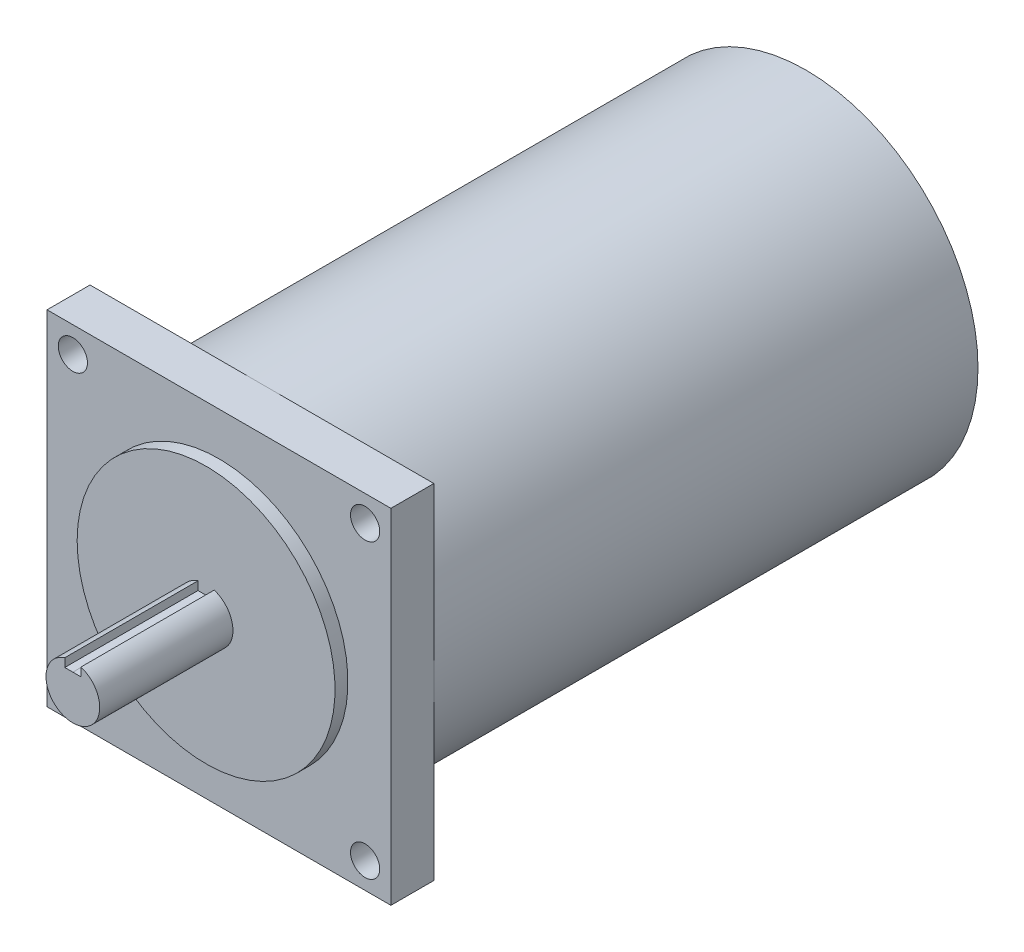
ISO-10303-21;
HEADER;
FILE_DESCRIPTION(('STEP AP214'),'2;1');
FILE_NAME('part.step','',(''),(''),'','','');
FILE_SCHEMA(('AUTOMOTIVE_DESIGN { 1 0 10303 214 1 1 1 1 }'));
ENDSEC;
DATA;
#1=APPLICATION_CONTEXT('core data for automotive mechanical design processes');
#2=APPLICATION_PROTOCOL_DEFINITION('international standard','automotive_design',2000,#1);
#3=PRODUCT_CONTEXT('',#1,'mechanical');
#4=PRODUCT('Part','Part','',(#3));
#5=PRODUCT_RELATED_PRODUCT_CATEGORY('part','',(#4));
#6=PRODUCT_DEFINITION_FORMATION('','',#4);
#7=PRODUCT_DEFINITION_CONTEXT('part definition',#1,'design');
#8=PRODUCT_DEFINITION('design','',#6,#7);
#9=PRODUCT_DEFINITION_SHAPE('','',#8);
#10=(LENGTH_UNIT() NAMED_UNIT(*) SI_UNIT(.MILLI.,.METRE.));
#11=(NAMED_UNIT(*) PLANE_ANGLE_UNIT() SI_UNIT($,.RADIAN.));
#12=(NAMED_UNIT(*) SI_UNIT($,.STERADIAN.) SOLID_ANGLE_UNIT());
#13=UNCERTAINTY_MEASURE_WITH_UNIT(LENGTH_MEASURE(1.E-05),#10,'distance_accuracy_value','');
#14=(GEOMETRIC_REPRESENTATION_CONTEXT(3) GLOBAL_UNCERTAINTY_ASSIGNED_CONTEXT((#13)) GLOBAL_UNIT_ASSIGNED_CONTEXT((#10,
#11,#12)) REPRESENTATION_CONTEXT('',''));
#15=CARTESIAN_POINT('',(0.,0.,0.));
#16=DIRECTION('',(0.,0.,1.));
#17=DIRECTION('',(1.,0.,0.));
#18=AXIS2_PLACEMENT_3D('',#15,#16,#17);
#19=CARTESIAN_POINT('',(0.,0.,0.));
#20=DIRECTION('',(0.,0.,1.));
#21=DIRECTION('',(1.,0.,0.));
#22=AXIS2_PLACEMENT_3D('',#19,#20,#21);
#23=PLANE('',#22);
#24=CARTESIAN_POINT('',(0.,0.,0.));
#25=DIRECTION('',(0.,0.,-1.));
#26=DIRECTION('',(-1.,0.,0.));
#27=AXIS2_PLACEMENT_3D('',#24,#25,#26);
#28=CIRCLE('',#27,50.8);
#29=CARTESIAN_POINT('',(-50.8,0.,0.));
#30=VERTEX_POINT('',#29);
#31=CARTESIAN_POINT('',(0.,50.8,0.));
#32=VERTEX_POINT('',#31);
#33=EDGE_CURVE('E141',#30,#32,#28,.T.);
#34=ORIENTED_EDGE('',*,*,#33,.F.);
#35=DIRECTION('',(0.,-1.,0.));
#36=VECTOR('',#35,1.);
#37=CARTESIAN_POINT('',(-50.8,50.8,0.));
#38=LINE('',#37,#36);
#39=CARTESIAN_POINT('',(-50.8,50.8,0.));
#40=VERTEX_POINT('',#39);
#41=EDGE_CURVE('E123',#40,#30,#38,.T.);
#42=ORIENTED_EDGE('',*,*,#41,.F.);
#43=DIRECTION('',(-1.,0.,0.));
#44=VECTOR('',#43,1.);
#45=CARTESIAN_POINT('',(-50.8,50.8,0.));
#46=LINE('',#45,#44);
#47=EDGE_CURVE('E143',#32,#40,#46,.T.);
#48=ORIENTED_EDGE('',*,*,#47,.F.);
#49=EDGE_LOOP('',(#34,#42,#48));
#50=FACE_BOUND('',#49,.T.);
#51=CARTESIAN_POINT('',(-43.18,43.18,0.));
#52=DIRECTION('',(0.,0.,1.));
#53=DIRECTION('',(1.,0.,0.));
#54=AXIS2_PLACEMENT_3D('',#51,#52,#53);
#55=CIRCLE('',#54,4.318);
#56=CARTESIAN_POINT('',(-38.862,43.18,0.));
#57=VERTEX_POINT('',#56);
#58=EDGE_CURVE('E196',#57,#57,#55,.T.);
#59=ORIENTED_EDGE('',*,*,#58,.T.);
#60=EDGE_LOOP('',(#59));
#61=FACE_BOUND('',#60,.T.);
#62=ADVANCED_FACE('F34',(#50,#61),#23,.F.);
#63=CARTESIAN_POINT('',(50.8,0.,0.));
#64=VERTEX_POINT('',#63);
#65=EDGE_CURVE('E51',#32,#64,#28,.T.);
#66=ORIENTED_EDGE('',*,*,#65,.F.);
#67=CARTESIAN_POINT('',(50.8,50.8,0.));
#68=VERTEX_POINT('',#67);
#69=EDGE_CURVE('E139',#68,#32,#46,.T.);
#70=ORIENTED_EDGE('',*,*,#69,.F.);
#71=DIRECTION('',(0.,1.,0.));
#72=VECTOR('',#71,1.);
#73=CARTESIAN_POINT('',(50.8,50.8,0.));
#74=LINE('',#73,#72);
#75=EDGE_CURVE('E220',#64,#68,#74,.T.);
#76=ORIENTED_EDGE('',*,*,#75,.F.);
#77=EDGE_LOOP('',(#66,#70,#76));
#78=FACE_BOUND('',#77,.T.);
#79=CARTESIAN_POINT('',(43.18,43.18,0.));
#80=DIRECTION('',(0.,0.,1.));
#81=DIRECTION('',(1.,0.,0.));
#82=AXIS2_PLACEMENT_3D('',#79,#80,#81);
#83=CIRCLE('',#82,4.318);
#84=CARTESIAN_POINT('',(47.498,43.18,0.));
#85=VERTEX_POINT('',#84);
#86=EDGE_CURVE('E202',#85,#85,#83,.T.);
#87=ORIENTED_EDGE('',*,*,#86,.T.);
#88=EDGE_LOOP('',(#87));
#89=FACE_BOUND('',#88,.T.);
#90=ADVANCED_FACE('F248',(#78,#89),#23,.F.);
#91=CARTESIAN_POINT('',(0.,-50.8,0.));
#92=VERTEX_POINT('',#91);
#93=EDGE_CURVE('E151',#64,#92,#28,.T.);
#94=ORIENTED_EDGE('',*,*,#93,.F.);
#95=CARTESIAN_POINT('',(50.8,-50.8,0.));
#96=VERTEX_POINT('',#95);
#97=EDGE_CURVE('E233',#96,#64,#74,.T.);
#98=ORIENTED_EDGE('',*,*,#97,.F.);
#99=DIRECTION('',(1.,0.,0.));
#100=VECTOR('',#99,1.);
#101=CARTESIAN_POINT('',(-50.8,-50.8,0.));
#102=LINE('',#101,#100);
#103=EDGE_CURVE('E133',#92,#96,#102,.T.);
#104=ORIENTED_EDGE('',*,*,#103,.F.);
#105=EDGE_LOOP('',(#94,#98,#104));
#106=FACE_BOUND('',#105,.T.);
#107=CARTESIAN_POINT('',(43.18,-43.18,0.));
#108=DIRECTION('',(0.,0.,1.));
#109=DIRECTION('',(1.,0.,0.));
#110=AXIS2_PLACEMENT_3D('',#107,#108,#109);
#111=CIRCLE('',#110,4.318);
#112=CARTESIAN_POINT('',(47.498,-43.18,0.));
#113=VERTEX_POINT('',#112);
#114=EDGE_CURVE('E208',#113,#113,#111,.T.);
#115=ORIENTED_EDGE('',*,*,#114,.T.);
#116=EDGE_LOOP('',(#115));
#117=FACE_BOUND('',#116,.T.);
#118=ADVANCED_FACE('F251',(#106,#117),#23,.F.);
#119=CARTESIAN_POINT('',(0.,0.,55.88));
#120=DIRECTION('',(0.,0.,-1.));
#121=DIRECTION('',(-1.,0.,0.));
#122=AXIS2_PLACEMENT_3D('',#119,#120,#121);
#123=CYLINDRICAL_SURFACE('',#122,7.9375);
#124=DIRECTION('',(0.,0.,-1.));
#125=VECTOR('',#124,1.);
#126=CARTESIAN_POINT('',(2.38760548199158,7.56989077281593,302.564684499768));
#127=LINE('',#126,#125);
#128=CARTESIAN_POINT('',(2.38760548199158,7.56989077281593,55.88));
#129=VERTEX_POINT('',#128);
#130=CARTESIAN_POINT('',(2.38760548199158,7.56989077281593,16.51));
#131=VERTEX_POINT('',#130);
#132=EDGE_CURVE('E184',#129,#131,#127,.T.);
#133=ORIENTED_EDGE('',*,*,#132,.F.);
#134=CARTESIAN_POINT('',(0.,0.,55.88));
#135=DIRECTION('',(0.,0.,1.));
#136=DIRECTION('',(1.,0.,0.));
#137=AXIS2_PLACEMENT_3D('',#134,#135,#136);
#138=CIRCLE('',#137,7.9375);
#139=CARTESIAN_POINT('',(-2.38759451800842,7.56989423093719,55.88));
#140=VERTEX_POINT('',#139);
#141=EDGE_CURVE('E166',#140,#129,#138,.T.);
#142=ORIENTED_EDGE('',*,*,#141,.F.);
#143=DIRECTION('',(0.,0.,-1.));
#144=VECTOR('',#143,1.);
#145=CARTESIAN_POINT('',(-2.38759451800842,7.56989423093719,302.564684499768));
#146=LINE('',#145,#144);
#147=CARTESIAN_POINT('',(-2.38759451800842,7.56989423093719,16.51));
#148=VERTEX_POINT('',#147);
#149=EDGE_CURVE('E175',#140,#148,#146,.T.);
#150=ORIENTED_EDGE('',*,*,#149,.T.);
#151=CARTESIAN_POINT('',(0.,0.,16.51));
#152=DIRECTION('',(0.,0.,1.));
#153=DIRECTION('',(1.,0.,0.));
#154=AXIS2_PLACEMENT_3D('',#151,#152,#153);
#155=CIRCLE('',#154,7.9375);
#156=EDGE_CURVE('E152',#148,#131,#155,.T.);
#157=ORIENTED_EDGE('',*,*,#156,.T.);
#158=EDGE_LOOP('',(#133,#142,#150,#157));
#159=FACE_BOUND('',#158,.T.);
#160=ADVANCED_FACE('F285',(#159),#123,.T.);
#161=CARTESIAN_POINT('',(0.,0.,55.88));
#162=DIRECTION('',(0.,0.,1.));
#163=DIRECTION('',(1.,0.,0.));
#164=AXIS2_PLACEMENT_3D('',#161,#162,#163);
#165=PLANE('',#164);
#166=ORIENTED_EDGE('',*,*,#141,.T.);
#167=DIRECTION('',(0.,1.,0.));
#168=VECTOR('',#167,1.);
#169=CARTESIAN_POINT('',(2.38760548199158,5.06380323093719,55.88));
#170=LINE('',#169,#168);
#171=CARTESIAN_POINT('',(2.38760548199158,5.06380323093719,55.88));
#172=VERTEX_POINT('',#171);
#173=EDGE_CURVE('E162',#172,#129,#170,.T.);
#174=ORIENTED_EDGE('',*,*,#173,.F.);
#175=DIRECTION('',(1.,0.,0.));
#176=VECTOR('',#175,1.);
#177=CARTESIAN_POINT('',(5.48199157633283E-06,5.06380323093719,55.88));
#178=LINE('',#177,#176);
#179=CARTESIAN_POINT('',(5.48199157633283E-06,5.06380323093719,55.88));
#180=VERTEX_POINT('',#179);
#181=EDGE_CURVE('E159',#180,#172,#178,.T.);
#182=ORIENTED_EDGE('',*,*,#181,.F.);
#183=DIRECTION('',(1.,0.,0.));
#184=VECTOR('',#183,1.);
#185=CARTESIAN_POINT('',(5.48199157633283E-06,5.06380323093719,55.88));
#186=LINE('',#185,#184);
#187=CARTESIAN_POINT('',(-2.38759451800842,5.06380323093719,55.88));
#188=VERTEX_POINT('',#187);
#189=EDGE_CURVE('E161',#188,#180,#186,.T.);
#190=ORIENTED_EDGE('',*,*,#189,.F.);
#191=DIRECTION('',(0.,-1.,0.));
#192=VECTOR('',#191,1.);
#193=CARTESIAN_POINT('',(-2.38759451800842,5.06380323093719,55.88));
#194=LINE('',#193,#192);
#195=EDGE_CURVE('E164',#140,#188,#194,.T.);
#196=ORIENTED_EDGE('',*,*,#195,.F.);
#197=EDGE_LOOP('',(#166,#174,#182,#190,#196));
#198=FACE_BOUND('',#197,.T.);
#199=ADVANCED_FACE('F282',(#198),#165,.T.);
#200=CARTESIAN_POINT('',(0.,0.,12.7));
#201=DIRECTION('',(0.,0.,1.));
#202=DIRECTION('',(1.,0.,0.));
#203=AXIS2_PLACEMENT_3D('',#200,#201,#202);
#204=PLANE('',#203);
#205=CARTESIAN_POINT('',(0.,0.,12.7));
#206=DIRECTION('',(0.,0.,1.));
#207=DIRECTION('',(1.,0.,0.));
#208=AXIS2_PLACEMENT_3D('',#205,#206,#207);
#209=CIRCLE('',#208,38.1);
#210=CARTESIAN_POINT('',(-38.1,0.,12.7));
#211=VERTEX_POINT('',#210);
#212=EDGE_CURVE('E154',#211,#211,#209,.T.);
#213=ORIENTED_EDGE('',*,*,#212,.F.);
#214=EDGE_LOOP('',(#213));
#215=FACE_BOUND('',#214,.T.);
#216=CARTESIAN_POINT('',(43.18,43.18,12.7));
#217=DIRECTION('',(0.,0.,1.));
#218=DIRECTION('',(1.,0.,0.));
#219=AXIS2_PLACEMENT_3D('',#216,#217,#218);
#220=CIRCLE('',#219,4.318);
#221=CARTESIAN_POINT('',(47.498,43.18,12.7));
#222=VERTEX_POINT('',#221);
#223=EDGE_CURVE('E205',#222,#222,#220,.T.);
#224=ORIENTED_EDGE('',*,*,#223,.F.);
#225=EDGE_LOOP('',(#224));
#226=FACE_BOUND('',#225,.T.);
#227=CARTESIAN_POINT('',(-43.18,-43.18,12.7));
#228=DIRECTION('',(0.,0.,1.));
#229=DIRECTION('',(1.,0.,0.));
#230=AXIS2_PLACEMENT_3D('',#227,#228,#229);
#231=CIRCLE('',#230,4.318);
#232=CARTESIAN_POINT('',(-38.862,-43.18,12.7));
#233=VERTEX_POINT('',#232);
#234=EDGE_CURVE('E217',#233,#233,#231,.T.);
#235=ORIENTED_EDGE('',*,*,#234,.F.);
#236=EDGE_LOOP('',(#235));
#237=FACE_BOUND('',#236,.T.);
#238=DIRECTION('',(0.,1.,0.));
#239=VECTOR('',#238,1.);
#240=CARTESIAN_POINT('',(50.8,50.8,12.7));
#241=LINE('',#240,#239);
#242=CARTESIAN_POINT('',(50.8,-50.8,12.7));
#243=VERTEX_POINT('',#242);
#244=CARTESIAN_POINT('',(50.8,50.8,12.7));
#245=VERTEX_POINT('',#244);
#246=EDGE_CURVE('E223',#243,#245,#241,.T.);
#247=ORIENTED_EDGE('',*,*,#246,.T.);
#248=DIRECTION('',(-1.,0.,0.));
#249=VECTOR('',#248,1.);
#250=CARTESIAN_POINT('',(-50.8,50.8,12.7));
#251=LINE('',#250,#249);
#252=CARTESIAN_POINT('',(-50.8,50.8,12.7));
#253=VERTEX_POINT('',#252);
#254=EDGE_CURVE('E226',#245,#253,#251,.T.);
#255=ORIENTED_EDGE('',*,*,#254,.T.);
#256=DIRECTION('',(0.,-1.,0.));
#257=VECTOR('',#256,1.);
#258=CARTESIAN_POINT('',(-50.8,50.8,12.7));
#259=LINE('',#258,#257);
#260=CARTESIAN_POINT('',(-50.8,-50.8,12.7));
#261=VERTEX_POINT('',#260);
#262=EDGE_CURVE('E228',#253,#261,#259,.T.);
#263=ORIENTED_EDGE('',*,*,#262,.T.);
#264=DIRECTION('',(1.,0.,0.));
#265=VECTOR('',#264,1.);
#266=CARTESIAN_POINT('',(-50.8,-50.8,12.7));
#267=LINE('',#266,#265);
#268=EDGE_CURVE('E230',#261,#243,#267,.T.);
#269=ORIENTED_EDGE('',*,*,#268,.T.);
#270=EDGE_LOOP('',(#247,#255,#263,#269));
#271=FACE_BOUND('',#270,.T.);
#272=CARTESIAN_POINT('',(43.18,-43.18,12.7));
#273=DIRECTION('',(0.,0.,1.));
#274=DIRECTION('',(1.,0.,0.));
#275=AXIS2_PLACEMENT_3D('',#272,#273,#274);
#276=CIRCLE('',#275,4.318);
#277=CARTESIAN_POINT('',(47.498,-43.18,12.7));
#278=VERTEX_POINT('',#277);
#279=EDGE_CURVE('E211',#278,#278,#276,.T.);
#280=ORIENTED_EDGE('',*,*,#279,.F.);
#281=EDGE_LOOP('',(#280));
#282=FACE_BOUND('',#281,.T.);
#283=CARTESIAN_POINT('',(-43.18,43.18,12.7));
#284=DIRECTION('',(0.,0.,1.));
#285=DIRECTION('',(1.,0.,0.));
#286=AXIS2_PLACEMENT_3D('',#283,#284,#285);
#287=CIRCLE('',#286,4.318);
#288=CARTESIAN_POINT('',(-38.862,43.18,12.7));
#289=VERTEX_POINT('',#288);
#290=EDGE_CURVE('E199',#289,#289,#287,.T.);
#291=ORIENTED_EDGE('',*,*,#290,.F.);
#292=EDGE_LOOP('',(#291));
#293=FACE_BOUND('',#292,.T.);
#294=ADVANCED_FACE('F277',(#215,#226,#237,#271,#282,#293),#204,.T.);
#295=EDGE_CURVE('E59',#92,#30,#28,.T.);
#296=ORIENTED_EDGE('',*,*,#295,.F.);
#297=CARTESIAN_POINT('',(-50.8,-50.8,0.));
#298=VERTEX_POINT('',#297);
#299=EDGE_CURVE('E138',#298,#92,#102,.T.);
#300=ORIENTED_EDGE('',*,*,#299,.F.);
#301=EDGE_CURVE('E126',#30,#298,#38,.T.);
#302=ORIENTED_EDGE('',*,*,#301,.F.);
#303=EDGE_LOOP('',(#296,#300,#302));
#304=FACE_BOUND('',#303,.T.);
#305=CARTESIAN_POINT('',(-43.18,-43.18,0.));
#306=DIRECTION('',(0.,0.,1.));
#307=DIRECTION('',(1.,0.,0.));
#308=AXIS2_PLACEMENT_3D('',#305,#306,#307);
#309=CIRCLE('',#308,4.318);
#310=CARTESIAN_POINT('',(-38.862,-43.18,0.));
#311=VERTEX_POINT('',#310);
#312=EDGE_CURVE('E214',#311,#311,#309,.T.);
#313=ORIENTED_EDGE('',*,*,#312,.T.);
#314=EDGE_LOOP('',(#313));
#315=FACE_BOUND('',#314,.T.);
#316=ADVANCED_FACE('F135',(#304,#315),#23,.F.);
#317=CARTESIAN_POINT('',(50.8,50.8,12.7));
#318=DIRECTION('',(-1.,0.,0.));
#319=DIRECTION('',(0.,-1.,0.));
#320=AXIS2_PLACEMENT_3D('',#317,#318,#319);
#321=PLANE('',#320);
#322=ORIENTED_EDGE('',*,*,#97,.T.);
#323=ORIENTED_EDGE('',*,*,#75,.T.);
#324=DIRECTION('',(0.,0.,-1.));
#325=VECTOR('',#324,1.);
#326=CARTESIAN_POINT('',(50.8,50.8,12.7));
#327=LINE('',#326,#325);
#328=EDGE_CURVE('E38',#245,#68,#327,.T.);
#329=ORIENTED_EDGE('',*,*,#328,.F.);
#330=ORIENTED_EDGE('',*,*,#246,.F.);
#331=DIRECTION('',(0.,0.,-1.));
#332=VECTOR('',#331,1.);
#333=CARTESIAN_POINT('',(50.8,-50.8,12.7));
#334=LINE('',#333,#332);
#335=EDGE_CURVE('E232',#243,#96,#334,.T.);
#336=ORIENTED_EDGE('',*,*,#335,.T.);
#337=EDGE_LOOP('',(#322,#323,#329,#330,#336));
#338=FACE_BOUND('',#337,.T.);
#339=ADVANCED_FACE('F36',(#338),#321,.F.);
#340=CARTESIAN_POINT('',(-50.8,50.8,12.7));
#341=DIRECTION('',(0.,-1.,0.));
#342=DIRECTION('',(0.,0.,-1.));
#343=AXIS2_PLACEMENT_3D('',#340,#341,#342);
#344=PLANE('',#343);
#345=ORIENTED_EDGE('',*,*,#69,.T.);
#346=ORIENTED_EDGE('',*,*,#47,.T.);
#347=DIRECTION('',(0.,0.,-1.));
#348=VECTOR('',#347,1.);
#349=CARTESIAN_POINT('',(-50.8,50.8,12.7));
#350=LINE('',#349,#348);
#351=EDGE_CURVE('E130',#253,#40,#350,.T.);
#352=ORIENTED_EDGE('',*,*,#351,.F.);
#353=ORIENTED_EDGE('',*,*,#254,.F.);
#354=ORIENTED_EDGE('',*,*,#328,.T.);
#355=EDGE_LOOP('',(#345,#346,#352,#353,#354));
#356=FACE_BOUND('',#355,.T.);
#357=ADVANCED_FACE('F244',(#356),#344,.F.);
#358=CARTESIAN_POINT('',(-50.8,50.8,12.7));
#359=DIRECTION('',(1.,0.,0.));
#360=DIRECTION('',(0.,1.,0.));
#361=AXIS2_PLACEMENT_3D('',#358,#359,#360);
#362=PLANE('',#361);
#363=ORIENTED_EDGE('',*,*,#41,.T.);
#364=ORIENTED_EDGE('',*,*,#301,.T.);
#365=DIRECTION('',(0.,0.,-1.));
#366=VECTOR('',#365,1.);
#367=CARTESIAN_POINT('',(-50.8,-50.8,12.7));
#368=LINE('',#367,#366);
#369=EDGE_CURVE('E240',#261,#298,#368,.T.);
#370=ORIENTED_EDGE('',*,*,#369,.F.);
#371=ORIENTED_EDGE('',*,*,#262,.F.);
#372=ORIENTED_EDGE('',*,*,#351,.T.);
#373=EDGE_LOOP('',(#363,#364,#370,#371,#372));
#374=FACE_BOUND('',#373,.T.);
#375=ADVANCED_FACE('F124',(#374),#362,.F.);
#376=CARTESIAN_POINT('',(-50.8,-50.8,12.7));
#377=DIRECTION('',(0.,1.,0.));
#378=DIRECTION('',(0.,0.,1.));
#379=AXIS2_PLACEMENT_3D('',#376,#377,#378);
#380=PLANE('',#379);
#381=ORIENTED_EDGE('',*,*,#299,.T.);
#382=ORIENTED_EDGE('',*,*,#103,.T.);
#383=ORIENTED_EDGE('',*,*,#335,.F.);
#384=ORIENTED_EDGE('',*,*,#268,.F.);
#385=ORIENTED_EDGE('',*,*,#369,.T.);
#386=EDGE_LOOP('',(#381,#382,#383,#384,#385));
#387=FACE_BOUND('',#386,.T.);
#388=ADVANCED_FACE('F297',(#387),#380,.F.);
#389=CARTESIAN_POINT('',(-43.18,-43.18,12.7));
#390=DIRECTION('',(0.,0.,-1.));
#391=DIRECTION('',(-1.,0.,0.));
#392=AXIS2_PLACEMENT_3D('',#389,#390,#391);
#393=CYLINDRICAL_SURFACE('',#392,4.318);
#394=ORIENTED_EDGE('',*,*,#234,.T.);
#395=EDGE_LOOP('',(#394));
#396=FACE_BOUND('',#395,.T.);
#397=ORIENTED_EDGE('',*,*,#312,.F.);
#398=EDGE_LOOP('',(#397));
#399=FACE_BOUND('',#398,.T.);
#400=ADVANCED_FACE('F268',(#396,#399),#393,.F.);
#401=CARTESIAN_POINT('',(43.18,-43.18,12.7));
#402=DIRECTION('',(0.,0.,-1.));
#403=DIRECTION('',(-1.,0.,0.));
#404=AXIS2_PLACEMENT_3D('',#401,#402,#403);
#405=CYLINDRICAL_SURFACE('',#404,4.318);
#406=ORIENTED_EDGE('',*,*,#279,.T.);
#407=EDGE_LOOP('',(#406));
#408=FACE_BOUND('',#407,.T.);
#409=ORIENTED_EDGE('',*,*,#114,.F.);
#410=EDGE_LOOP('',(#409));
#411=FACE_BOUND('',#410,.T.);
#412=ADVANCED_FACE('F258',(#408,#411),#405,.F.);
#413=CARTESIAN_POINT('',(43.18,43.18,12.7));
#414=DIRECTION('',(0.,0.,-1.));
#415=DIRECTION('',(-1.,0.,0.));
#416=AXIS2_PLACEMENT_3D('',#413,#414,#415);
#417=CYLINDRICAL_SURFACE('',#416,4.318);
#418=ORIENTED_EDGE('',*,*,#223,.T.);
#419=EDGE_LOOP('',(#418));
#420=FACE_BOUND('',#419,.T.);
#421=ORIENTED_EDGE('',*,*,#86,.F.);
#422=EDGE_LOOP('',(#421));
#423=FACE_BOUND('',#422,.T.);
#424=ADVANCED_FACE('F255',(#420,#423),#417,.F.);
#425=CARTESIAN_POINT('',(-43.18,43.18,12.7));
#426=DIRECTION('',(0.,0.,-1.));
#427=DIRECTION('',(-1.,0.,0.));
#428=AXIS2_PLACEMENT_3D('',#425,#426,#427);
#429=CYLINDRICAL_SURFACE('',#428,4.318);
#430=ORIENTED_EDGE('',*,*,#290,.T.);
#431=EDGE_LOOP('',(#430));
#432=FACE_BOUND('',#431,.T.);
#433=ORIENTED_EDGE('',*,*,#58,.F.);
#434=EDGE_LOOP('',(#433));
#435=FACE_BOUND('',#434,.T.);
#436=ADVANCED_FACE('F257',(#432,#435),#429,.F.);
#437=CARTESIAN_POINT('',(0.,0.,16.51));
#438=DIRECTION('',(0.,0.,-1.));
#439=DIRECTION('',(-1.,0.,0.));
#440=AXIS2_PLACEMENT_3D('',#437,#438,#439);
#441=CYLINDRICAL_SURFACE('',#440,38.1);
#442=CARTESIAN_POINT('',(0.,0.,16.51));
#443=DIRECTION('',(0.,0.,1.));
#444=DIRECTION('',(1.,0.,0.));
#445=AXIS2_PLACEMENT_3D('',#442,#443,#444);
#446=CIRCLE('',#445,38.1);
#447=CARTESIAN_POINT('',(-38.1,0.,16.51));
#448=VERTEX_POINT('',#447);
#449=EDGE_CURVE('E192',#448,#448,#446,.T.);
#450=CARTESIAN_POINT('',(-38.1,0.,16.51));
#451=CARTESIAN_POINT('',(-38.1,0.,16.4703125));
#452=CARTESIAN_POINT('',(-38.1,0.,16.430625));
#453=CARTESIAN_POINT('',(-38.1,0.,16.35125));
#454=CARTESIAN_POINT('',(-38.1,0.,16.3115625));
#455=CARTESIAN_POINT('',(-38.1,0.,16.2321875));
#456=CARTESIAN_POINT('',(-38.1,0.,16.1925));
#457=CARTESIAN_POINT('',(-38.1,0.,16.113125));
#458=CARTESIAN_POINT('',(-38.1,0.,16.0734375));
#459=CARTESIAN_POINT('',(-38.1,0.,15.9940625));
#460=CARTESIAN_POINT('',(-38.1,0.,15.954375));
#461=CARTESIAN_POINT('',(-38.1,0.,15.875));
#462=CARTESIAN_POINT('',(-38.1,0.,15.8353125));
#463=CARTESIAN_POINT('',(-38.1,0.,15.7559375));
#464=CARTESIAN_POINT('',(-38.1,0.,15.71625));
#465=CARTESIAN_POINT('',(-38.1,0.,15.636875));
#466=CARTESIAN_POINT('',(-38.1,0.,15.5971875));
#467=CARTESIAN_POINT('',(-38.1,0.,15.5178125));
#468=CARTESIAN_POINT('',(-38.1,0.,15.478125));
#469=CARTESIAN_POINT('',(-38.1,0.,15.39875));
#470=CARTESIAN_POINT('',(-38.1,0.,15.3590625));
#471=CARTESIAN_POINT('',(-38.1,0.,15.2796875));
#472=CARTESIAN_POINT('',(-38.1,0.,15.24));
#473=CARTESIAN_POINT('',(-38.1,0.,15.160625));
#474=CARTESIAN_POINT('',(-38.1,0.,15.1209375));
#475=CARTESIAN_POINT('',(-38.1,0.,15.0415625));
#476=CARTESIAN_POINT('',(-38.1,0.,15.001875));
#477=CARTESIAN_POINT('',(-38.1,0.,14.9225));
#478=CARTESIAN_POINT('',(-38.1,0.,14.8828125));
#479=CARTESIAN_POINT('',(-38.1,0.,14.8034375));
#480=CARTESIAN_POINT('',(-38.1,0.,14.76375));
#481=CARTESIAN_POINT('',(-38.1,0.,14.684375));
#482=CARTESIAN_POINT('',(-38.1,0.,14.6446875));
#483=CARTESIAN_POINT('',(-38.1,0.,14.5653125));
#484=CARTESIAN_POINT('',(-38.1,0.,14.525625));
#485=CARTESIAN_POINT('',(-38.1,0.,14.44625));
#486=CARTESIAN_POINT('',(-38.1,0.,14.4065625));
#487=CARTESIAN_POINT('',(-38.1,0.,14.3271875));
#488=CARTESIAN_POINT('',(-38.1,0.,14.2875));
#489=CARTESIAN_POINT('',(-38.1,0.,14.208125));
#490=CARTESIAN_POINT('',(-38.1,0.,14.1684375));
#491=CARTESIAN_POINT('',(-38.1,0.,14.0890625));
#492=CARTESIAN_POINT('',(-38.1,0.,14.049375));
#493=CARTESIAN_POINT('',(-38.1,0.,13.97));
#494=CARTESIAN_POINT('',(-38.1,0.,13.9303125));
#495=CARTESIAN_POINT('',(-38.1,0.,13.8509375));
#496=CARTESIAN_POINT('',(-38.1,0.,13.81125));
#497=CARTESIAN_POINT('',(-38.1,0.,13.731875));
#498=CARTESIAN_POINT('',(-38.1,0.,13.6921875));
#499=CARTESIAN_POINT('',(-38.1,0.,13.6128125));
#500=CARTESIAN_POINT('',(-38.1,0.,13.573125));
#501=CARTESIAN_POINT('',(-38.1,0.,13.49375));
#502=CARTESIAN_POINT('',(-38.1,0.,13.4540625));
#503=CARTESIAN_POINT('',(-38.1,0.,13.3746875));
#504=CARTESIAN_POINT('',(-38.1,0.,13.335));
#505=CARTESIAN_POINT('',(-38.1,0.,13.255625));
#506=CARTESIAN_POINT('',(-38.1,0.,13.2159375));
#507=CARTESIAN_POINT('',(-38.1,0.,13.1365625));
#508=CARTESIAN_POINT('',(-38.1,0.,13.096875));
#509=CARTESIAN_POINT('',(-38.1,0.,13.0175));
#510=CARTESIAN_POINT('',(-38.1,0.,12.9778125));
#511=CARTESIAN_POINT('',(-38.1,0.,12.8984375));
#512=CARTESIAN_POINT('',(-38.1,0.,12.85875));
#513=CARTESIAN_POINT('',(-38.1,0.,12.779375));
#514=CARTESIAN_POINT('',(-38.1,0.,12.7396875));
#515=CARTESIAN_POINT('',(-38.1,0.,12.7));
#516=B_SPLINE_CURVE_WITH_KNOTS('',3,(#450,#451,#452,#453,#454,#455,#456,#457,#458,#459,#460,
#461,#462,#463,#464,#465,#466,#467,#468,#469,#470,#471,#472,#473,#474,#475,#476,#477,#478,#479,
#480,#481,#482,#483,#484,#485,#486,#487,#488,#489,#490,#491,#492,#493,#494,#495,#496,#497,#498,
#499,#500,#501,#502,#503,#504,#505,#506,#507,#508,#509,#510,#511,#512,#513,#514,#515),
.UNSPECIFIED.,.F.,.F.,(4,2,2,2,2,2,2,2,2,2,2,2,2,2,2,2,2,2,2,2,2,2,2,2,2,2,2,2,2,2,2,2,4),(0.,
0.119062499999999,0.238124999999999,0.357187499999998,0.476249999999998,0.595312499999997,
0.714375,0.833437499999999,0.952499999999998,1.0715625,1.190625,1.3096875,1.42875,1.5478125,
1.666875,1.7859375,1.905,2.0240625,2.143125,2.2621875,2.38125,2.5003125,2.619375,2.7384375,
2.8575,2.9765625,3.095625,3.2146875,3.33375,3.4528125,3.571875,3.6909375,3.81),.UNSPECIFIED.);
#517=EDGE_CURVE('BSEAM265',#448,#211,#516,.T.);
#518=ORIENTED_EDGE('',*,*,#449,.F.);
#519=ORIENTED_EDGE('',*,*,#212,.T.);
#520=ORIENTED_EDGE('',*,*,#517,.T.);
#521=ORIENTED_EDGE('',*,*,#517,.F.);
#522=EDGE_LOOP('',(#518,#520,#519,#521));
#523=FACE_BOUND('',#522,.T.);
#524=ADVANCED_FACE('F265',(#523),#441,.T.);
#525=CARTESIAN_POINT('',(0.,0.,16.51));
#526=DIRECTION('',(0.,0.,1.));
#527=DIRECTION('',(1.,0.,0.));
#528=AXIS2_PLACEMENT_3D('',#525,#526,#527);
#529=PLANE('',#528);
#530=ORIENTED_EDGE('',*,*,#156,.F.);
#531=DIRECTION('',(0.,-1.,0.));
#532=VECTOR('',#531,1.);
#533=CARTESIAN_POINT('',(-2.38759451800842,5.06380323093719,16.51));
#534=LINE('',#533,#532);
#535=CARTESIAN_POINT('',(-2.38759451800842,5.06380323093719,16.51));
#536=VERTEX_POINT('',#535);
#537=EDGE_CURVE('E167',#148,#536,#534,.T.);
#538=ORIENTED_EDGE('',*,*,#537,.T.);
#539=DIRECTION('',(1.,0.,0.));
#540=VECTOR('',#539,1.);
#541=CARTESIAN_POINT('',(5.48199157633283E-06,5.06380323093719,16.51));
#542=LINE('',#541,#540);
#543=CARTESIAN_POINT('',(5.48199157633283E-06,5.06380323093719,16.51));
#544=VERTEX_POINT('',#543);
#545=EDGE_CURVE('E169',#536,#544,#542,.T.);
#546=ORIENTED_EDGE('',*,*,#545,.T.);
#547=DIRECTION('',(1.,0.,0.));
#548=VECTOR('',#547,1.);
#549=CARTESIAN_POINT('',(5.48199157633283E-06,5.06380323093719,16.51));
#550=LINE('',#549,#548);
#551=CARTESIAN_POINT('',(2.38760548199158,5.06380323093719,16.51));
#552=VERTEX_POINT('',#551);
#553=EDGE_CURVE('E171',#544,#552,#550,.T.);
#554=ORIENTED_EDGE('',*,*,#553,.T.);
#555=DIRECTION('',(0.,1.,0.));
#556=VECTOR('',#555,1.);
#557=CARTESIAN_POINT('',(2.38760548199158,5.06380323093719,16.51));
#558=LINE('',#557,#556);
#559=EDGE_CURVE('E173',#552,#131,#558,.T.);
#560=ORIENTED_EDGE('',*,*,#559,.T.);
#561=EDGE_LOOP('',(#530,#538,#546,#554,#560));
#562=FACE_BOUND('',#561,.T.);
#563=ORIENTED_EDGE('',*,*,#449,.T.);
#564=EDGE_LOOP('',(#563));
#565=FACE_BOUND('',#564,.T.);
#566=ADVANCED_FACE('F400',(#562,#565),#529,.T.);
#567=CARTESIAN_POINT('',(2.38760548199158,5.06380323093719,302.564684499768));
#568=DIRECTION('',(-1.,0.,0.));
#569=DIRECTION('',(0.,0.,1.));
#570=AXIS2_PLACEMENT_3D('',#567,#568,#569);
#571=PLANE('',#570);
#572=DIRECTION('',(0.,0.,-1.));
#573=VECTOR('',#572,1.);
#574=CARTESIAN_POINT('',(2.38760548199158,5.06380323093719,302.564684499768));
#575=LINE('',#574,#573);
#576=EDGE_CURVE('E187',#172,#552,#575,.T.);
#577=ORIENTED_EDGE('',*,*,#576,.F.);
#578=ORIENTED_EDGE('',*,*,#173,.T.);
#579=ORIENTED_EDGE('',*,*,#132,.T.);
#580=ORIENTED_EDGE('',*,*,#559,.F.);
#581=EDGE_LOOP('',(#577,#578,#579,#580));
#582=FACE_BOUND('',#581,.T.);
#583=ADVANCED_FACE('F396',(#582),#571,.T.);
#584=CARTESIAN_POINT('',(5.48199157633283E-06,5.06380323093719,302.564684499768));
#585=DIRECTION('',(0.,1.,0.));
#586=DIRECTION('',(0.,0.,1.));
#587=AXIS2_PLACEMENT_3D('',#584,#585,#586);
#588=PLANE('',#587);
#589=DIRECTION('',(0.,0.,-1.));
#590=VECTOR('',#589,1.);
#591=CARTESIAN_POINT('',(5.48199157633283E-06,5.06380323093719,302.564684499768));
#592=LINE('',#591,#590);
#593=EDGE_CURVE('E181',#180,#544,#592,.T.);
#594=ORIENTED_EDGE('',*,*,#593,.F.);
#595=ORIENTED_EDGE('',*,*,#181,.T.);
#596=ORIENTED_EDGE('',*,*,#576,.T.);
#597=ORIENTED_EDGE('',*,*,#553,.F.);
#598=EDGE_LOOP('',(#594,#595,#596,#597));
#599=FACE_BOUND('',#598,.T.);
#600=ADVANCED_FACE('F399',(#599),#588,.T.);
#601=CARTESIAN_POINT('',(5.48199157633283E-06,5.06380323093719,302.564684499768));
#602=DIRECTION('',(0.,1.,0.));
#603=DIRECTION('',(0.,0.,1.));
#604=AXIS2_PLACEMENT_3D('',#601,#602,#603);
#605=PLANE('',#604);
#606=DIRECTION('',(0.,0.,-1.));
#607=VECTOR('',#606,1.);
#608=CARTESIAN_POINT('',(-2.38759451800842,5.06380323093719,302.564684499768));
#609=LINE('',#608,#607);
#610=EDGE_CURVE('E178',#188,#536,#609,.T.);
#611=ORIENTED_EDGE('',*,*,#610,.F.);
#612=ORIENTED_EDGE('',*,*,#189,.T.);
#613=ORIENTED_EDGE('',*,*,#593,.T.);
#614=ORIENTED_EDGE('',*,*,#545,.F.);
#615=EDGE_LOOP('',(#611,#612,#613,#614));
#616=FACE_BOUND('',#615,.T.);
#617=ADVANCED_FACE('F404',(#616),#605,.T.);
#618=CARTESIAN_POINT('',(-2.38759451800842,5.06380323093719,302.564684499768));
#619=DIRECTION('',(1.,0.,0.));
#620=DIRECTION('',(0.,0.,-1.));
#621=AXIS2_PLACEMENT_3D('',#618,#619,#620);
#622=PLANE('',#621);
#623=ORIENTED_EDGE('',*,*,#149,.F.);
#624=ORIENTED_EDGE('',*,*,#195,.T.);
#625=ORIENTED_EDGE('',*,*,#610,.T.);
#626=ORIENTED_EDGE('',*,*,#537,.F.);
#627=EDGE_LOOP('',(#623,#624,#625,#626));
#628=FACE_BOUND('',#627,.T.);
#629=ADVANCED_FACE('F338',(#628),#622,.T.);
#630=CARTESIAN_POINT('',(0.,0.,-160.782));
#631=DIRECTION('',(0.,0.,1.));
#632=DIRECTION('',(1.,0.,0.));
#633=AXIS2_PLACEMENT_3D('',#630,#631,#632);
#634=CYLINDRICAL_SURFACE('',#633,50.8);
#635=CARTESIAN_POINT('',(0.,0.,-160.782));
#636=DIRECTION('',(0.,0.,-1.));
#637=DIRECTION('',(-1.,0.,0.));
#638=AXIS2_PLACEMENT_3D('',#635,#636,#637);
#639=CIRCLE('',#638,50.8);
#640=CARTESIAN_POINT('',(-50.8,0.,-160.782));
#641=VERTEX_POINT('',#640);
#642=EDGE_CURVE('E146',#641,#641,#639,.T.);
#643=ORIENTED_EDGE('',*,*,#642,.F.);
#644=EDGE_LOOP('',(#643));
#645=FACE_BOUND('',#644,.T.);
#646=ORIENTED_EDGE('',*,*,#33,.T.);
#647=ORIENTED_EDGE('',*,*,#65,.T.);
#648=ORIENTED_EDGE('',*,*,#93,.T.);
#649=ORIENTED_EDGE('',*,*,#295,.T.);
#650=EDGE_LOOP('',(#646,#647,#648,#649));
#651=FACE_BOUND('',#650,.T.);
#652=ADVANCED_FACE('F150',(#645,#651),#634,.T.);
#653=CARTESIAN_POINT('',(0.,0.,-160.782));
#654=DIRECTION('',(0.,0.,-1.));
#655=DIRECTION('',(-1.,0.,0.));
#656=AXIS2_PLACEMENT_3D('',#653,#654,#655);
#657=PLANE('',#656);
#658=CARTESIAN_POINT('',(0.,0.,-160.782));
#659=DIRECTION('',(0.,0.,-1.));
#660=DIRECTION('',(-1.,0.,0.));
#661=AXIS2_PLACEMENT_3D('',#658,#659,#660);
#662=CIRCLE('',#661,38.1);
#663=CARTESIAN_POINT('',(38.1,0.,-160.782));
#664=VERTEX_POINT('',#663);
#665=EDGE_CURVE('E43',#664,#664,#662,.T.);
#666=ORIENTED_EDGE('',*,*,#665,.F.);
#667=EDGE_LOOP('',(#666));
#668=FACE_BOUND('',#667,.T.);
#669=ORIENTED_EDGE('',*,*,#642,.T.);
#670=EDGE_LOOP('',(#669));
#671=FACE_BOUND('',#670,.T.);
#672=ADVANCED_FACE('F337',(#668,#671),#657,.T.);
#673=CARTESIAN_POINT('',(0.,0.,-164.592));
#674=DIRECTION('',(0.,0.,1.));
#675=DIRECTION('',(1.,0.,0.));
#676=AXIS2_PLACEMENT_3D('',#673,#674,#675);
#677=CYLINDRICAL_SURFACE('',#676,38.1);
#678=CARTESIAN_POINT('',(0.,0.,-164.592));
#679=DIRECTION('',(0.,0.,-1.));
#680=DIRECTION('',(-1.,0.,0.));
#681=AXIS2_PLACEMENT_3D('',#678,#679,#680);
#682=CIRCLE('',#681,38.1);
#683=CARTESIAN_POINT('',(38.1,0.,-164.592));
#684=VERTEX_POINT('',#683);
#685=EDGE_CURVE('E147',#684,#684,#682,.T.);
#686=CARTESIAN_POINT('',(38.1,0.,-164.592));
#687=CARTESIAN_POINT('',(38.1,0.,-164.5523125));
#688=CARTESIAN_POINT('',(38.1,0.,-164.512625));
#689=CARTESIAN_POINT('',(38.1,0.,-164.43325));
#690=CARTESIAN_POINT('',(38.1,0.,-164.3935625));
#691=CARTESIAN_POINT('',(38.1,0.,-164.3141875));
#692=CARTESIAN_POINT('',(38.1,0.,-164.2745));
#693=CARTESIAN_POINT('',(38.1,0.,-164.195125));
#694=CARTESIAN_POINT('',(38.1,0.,-164.1554375));
#695=CARTESIAN_POINT('',(38.1,0.,-164.0760625));
#696=CARTESIAN_POINT('',(38.1,0.,-164.036375));
#697=CARTESIAN_POINT('',(38.1,0.,-163.957));
#698=CARTESIAN_POINT('',(38.1,0.,-163.9173125));
#699=CARTESIAN_POINT('',(38.1,0.,-163.8379375));
#700=CARTESIAN_POINT('',(38.1,0.,-163.79825));
#701=CARTESIAN_POINT('',(38.1,0.,-163.718875));
#702=CARTESIAN_POINT('',(38.1,0.,-163.6791875));
#703=CARTESIAN_POINT('',(38.1,0.,-163.5998125));
#704=CARTESIAN_POINT('',(38.1,0.,-163.560125));
#705=CARTESIAN_POINT('',(38.1,0.,-163.48075));
#706=CARTESIAN_POINT('',(38.1,0.,-163.4410625));
#707=CARTESIAN_POINT('',(38.1,0.,-163.3616875));
#708=CARTESIAN_POINT('',(38.1,0.,-163.322));
#709=CARTESIAN_POINT('',(38.1,0.,-163.242625));
#710=CARTESIAN_POINT('',(38.1,0.,-163.2029375));
#711=CARTESIAN_POINT('',(38.1,0.,-163.1235625));
#712=CARTESIAN_POINT('',(38.1,0.,-163.083875));
#713=CARTESIAN_POINT('',(38.1,0.,-163.0045));
#714=CARTESIAN_POINT('',(38.1,0.,-162.9648125));
#715=CARTESIAN_POINT('',(38.1,0.,-162.8854375));
#716=CARTESIAN_POINT('',(38.1,0.,-162.84575));
#717=CARTESIAN_POINT('',(38.1,0.,-162.766375));
#718=CARTESIAN_POINT('',(38.1,0.,-162.7266875));
#719=CARTESIAN_POINT('',(38.1,0.,-162.6473125));
#720=CARTESIAN_POINT('',(38.1,0.,-162.607625));
#721=CARTESIAN_POINT('',(38.1,0.,-162.52825));
#722=CARTESIAN_POINT('',(38.1,0.,-162.4885625));
#723=CARTESIAN_POINT('',(38.1,0.,-162.4091875));
#724=CARTESIAN_POINT('',(38.1,0.,-162.3695));
#725=CARTESIAN_POINT('',(38.1,0.,-162.290125));
#726=CARTESIAN_POINT('',(38.1,0.,-162.2504375));
#727=CARTESIAN_POINT('',(38.1,0.,-162.1710625));
#728=CARTESIAN_POINT('',(38.1,0.,-162.131375));
#729=CARTESIAN_POINT('',(38.1,0.,-162.052));
#730=CARTESIAN_POINT('',(38.1,0.,-162.0123125));
#731=CARTESIAN_POINT('',(38.1,0.,-161.9329375));
#732=CARTESIAN_POINT('',(38.1,0.,-161.89325));
#733=CARTESIAN_POINT('',(38.1,0.,-161.813875));
#734=CARTESIAN_POINT('',(38.1,0.,-161.7741875));
#735=CARTESIAN_POINT('',(38.1,0.,-161.6948125));
#736=CARTESIAN_POINT('',(38.1,0.,-161.655125));
#737=CARTESIAN_POINT('',(38.1,0.,-161.57575));
#738=CARTESIAN_POINT('',(38.1,0.,-161.5360625));
#739=CARTESIAN_POINT('',(38.1,0.,-161.4566875));
#740=CARTESIAN_POINT('',(38.1,0.,-161.417));
#741=CARTESIAN_POINT('',(38.1,0.,-161.337625));
#742=CARTESIAN_POINT('',(38.1,0.,-161.2979375));
#743=CARTESIAN_POINT('',(38.1,0.,-161.2185625));
#744=CARTESIAN_POINT('',(38.1,0.,-161.178875));
#745=CARTESIAN_POINT('',(38.1,0.,-161.0995));
#746=CARTESIAN_POINT('',(38.1,0.,-161.0598125));
#747=CARTESIAN_POINT('',(38.1,0.,-160.9804375));
#748=CARTESIAN_POINT('',(38.1,0.,-160.94075));
#749=CARTESIAN_POINT('',(38.1,0.,-160.861375));
#750=CARTESIAN_POINT('',(38.1,0.,-160.8216875));
#751=CARTESIAN_POINT('',(38.1,0.,-160.782));
#752=B_SPLINE_CURVE_WITH_KNOTS('',3,(#686,#687,#688,#689,#690,#691,#692,#693,#694,#695,#696,
#697,#698,#699,#700,#701,#702,#703,#704,#705,#706,#707,#708,#709,#710,#711,#712,#713,#714,#715,
#716,#717,#718,#719,#720,#721,#722,#723,#724,#725,#726,#727,#728,#729,#730,#731,#732,#733,#734,
#735,#736,#737,#738,#739,#740,#741,#742,#743,#744,#745,#746,#747,#748,#749,#750,#751),
.UNSPECIFIED.,.F.,.F.,(4,2,2,2,2,2,2,2,2,2,2,2,2,2,2,2,2,2,2,2,2,2,2,2,2,2,2,2,2,2,2,2,4),(0.,
0.119062500000017,0.238125000000006,0.357187500000022,0.476250000000011,0.595312500000028,
0.714375000000017,0.833437500000006,0.952500000000023,1.07156250000001,1.19062500000003,
1.30968750000002,1.42875000000001,1.54781250000002,1.66687500000001,1.78593750000003,
1.90500000000002,2.02406250000001,2.14312500000002,2.26218750000001,2.38125000000003,
2.50031250000002,2.61937500000001,2.73843750000002,2.85750000000001,2.97656250000003,
3.09562500000002,3.21468750000001,3.33375000000002,3.45281250000001,3.57187500000003,
3.69093750000002,3.81000000000001),.UNSPECIFIED.);
#753=EDGE_CURVE('BSEAM350',#684,#664,#752,.T.);
#754=ORIENTED_EDGE('',*,*,#685,.F.);
#755=ORIENTED_EDGE('',*,*,#665,.T.);
#756=ORIENTED_EDGE('',*,*,#753,.T.);
#757=ORIENTED_EDGE('',*,*,#753,.F.);
#758=EDGE_LOOP('',(#754,#756,#755,#757));
#759=FACE_BOUND('',#758,.T.);
#760=ADVANCED_FACE('F350',(#759),#677,.T.);
#761=CARTESIAN_POINT('',(0.,0.,-164.592));
#762=DIRECTION('',(0.,0.,-1.));
#763=DIRECTION('',(-1.,0.,0.));
#764=AXIS2_PLACEMENT_3D('',#761,#762,#763);
#765=PLANE('',#764);
#766=CARTESIAN_POINT('',(0.,0.,-164.592));
#767=DIRECTION('',(0.,0.,-1.));
#768=DIRECTION('',(-1.,0.,0.));
#769=AXIS2_PLACEMENT_3D('',#766,#767,#768);
#770=CIRCLE('',#769,6.35);
#771=CARTESIAN_POINT('',(-6.35,0.,-164.592));
#772=VERTEX_POINT('',#771);
#773=EDGE_CURVE('E11',#772,#772,#770,.T.);
#774=ORIENTED_EDGE('',*,*,#773,.F.);
#775=EDGE_LOOP('',(#774));
#776=FACE_BOUND('',#775,.T.);
#777=ORIENTED_EDGE('',*,*,#685,.T.);
#778=EDGE_LOOP('',(#777));
#779=FACE_BOUND('',#778,.T.);
#780=ADVANCED_FACE('F360',(#776,#779),#765,.T.);
#781=CARTESIAN_POINT('',(0.,0.,-182.372));
#782=DIRECTION('',(0.,0.,1.));
#783=DIRECTION('',(1.,0.,0.));
#784=AXIS2_PLACEMENT_3D('',#781,#782,#783);
#785=CYLINDRICAL_SURFACE('',#784,6.35);
#786=CARTESIAN_POINT('',(0.,0.,-182.372));
#787=DIRECTION('',(0.,0.,-1.));
#788=DIRECTION('',(-1.,0.,0.));
#789=AXIS2_PLACEMENT_3D('',#786,#787,#788);
#790=CIRCLE('',#789,6.35);
#791=CARTESIAN_POINT('',(-6.35,0.,-182.372));
#792=VERTEX_POINT('',#791);
#793=EDGE_CURVE('E544',#792,#792,#790,.T.);
#794=ORIENTED_EDGE('',*,*,#793,.F.);
#795=EDGE_LOOP('',(#794));
#796=FACE_BOUND('',#795,.T.);
#797=ORIENTED_EDGE('',*,*,#773,.T.);
#798=EDGE_LOOP('',(#797));
#799=FACE_BOUND('',#798,.T.);
#800=ADVANCED_FACE('F370',(#796,#799),#785,.T.);
#801=CARTESIAN_POINT('',(0.,0.,-182.372));
#802=DIRECTION('',(0.,0.,-1.));
#803=DIRECTION('',(-1.,0.,0.));
#804=AXIS2_PLACEMENT_3D('',#801,#802,#803);
#805=PLANE('',#804);
#806=ORIENTED_EDGE('',*,*,#793,.T.);
#807=EDGE_LOOP('',(#806));
#808=FACE_BOUND('',#807,.T.);
#809=ADVANCED_FACE('F380',(#808),#805,.T.);
#810=CLOSED_SHELL('',(#62,#90,#118,#160,#199,#294,#316,#339,#357,#375,#388,#400,#412,#424,#436,
#524,#566,#583,#600,#617,#629,#652,#672,#760,#780,#800,#809));
#811=MANIFOLD_SOLID_BREP('B2',#810);
#812=ADVANCED_BREP_SHAPE_REPRESENTATION('',(#18,#811),#14);
#813=SHAPE_DEFINITION_REPRESENTATION(#9,#812);
ENDSEC;
END-ISO-10303-21;
